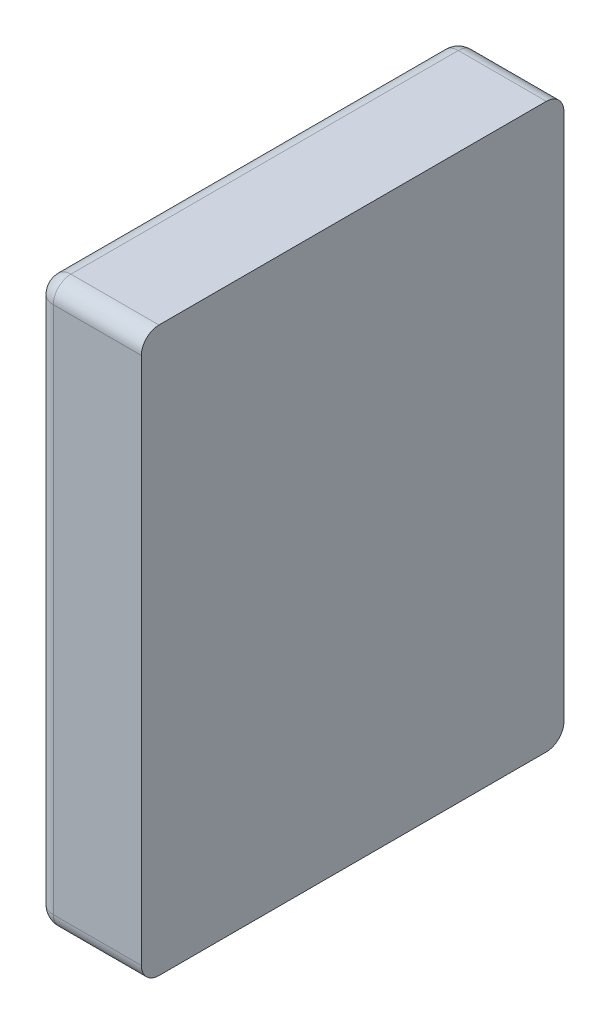
ISO-10303-21;
HEADER;
FILE_DESCRIPTION(('STEP AP214'),'2;1');
FILE_NAME('part.step','',(''),(''),'','','');
FILE_SCHEMA(('AUTOMOTIVE_DESIGN { 1 0 10303 214 1 1 1 1 }'));
ENDSEC;
DATA;
#1=APPLICATION_CONTEXT('core data for automotive mechanical design processes');
#2=APPLICATION_PROTOCOL_DEFINITION('international standard','automotive_design',2000,#1);
#3=PRODUCT_CONTEXT('',#1,'mechanical');
#4=PRODUCT('Part','Part','',(#3));
#5=PRODUCT_RELATED_PRODUCT_CATEGORY('part','',(#4));
#6=PRODUCT_DEFINITION_FORMATION('','',#4);
#7=PRODUCT_DEFINITION_CONTEXT('part definition',#1,'design');
#8=PRODUCT_DEFINITION('design','',#6,#7);
#9=PRODUCT_DEFINITION_SHAPE('','',#8);
#10=(LENGTH_UNIT() NAMED_UNIT(*) SI_UNIT(.MILLI.,.METRE.));
#11=(NAMED_UNIT(*) PLANE_ANGLE_UNIT() SI_UNIT($,.RADIAN.));
#12=(NAMED_UNIT(*) SI_UNIT($,.STERADIAN.) SOLID_ANGLE_UNIT());
#13=UNCERTAINTY_MEASURE_WITH_UNIT(LENGTH_MEASURE(1.E-05),#10,'distance_accuracy_value','');
#14=(GEOMETRIC_REPRESENTATION_CONTEXT(3) GLOBAL_UNCERTAINTY_ASSIGNED_CONTEXT((#13)) GLOBAL_UNIT_ASSIGNED_CONTEXT((#10,
#11,#12)) REPRESENTATION_CONTEXT('',''));
#15=CARTESIAN_POINT('',(0.,0.,0.));
#16=DIRECTION('',(0.,0.,1.));
#17=DIRECTION('',(1.,0.,0.));
#18=AXIS2_PLACEMENT_3D('',#15,#16,#17);
#19=CARTESIAN_POINT('',(-1.45,-0.8,1.2));
#20=DIRECTION('',(0.,0.,-1.));
#21=DIRECTION('',(0.,-1.,0.));
#22=AXIS2_PLACEMENT_3D('',#19,#20,#21);
#23=PLANE('',#22);
#24=DIRECTION('',(0.,1.,0.));
#25=VECTOR('',#24,1.);
#26=CARTESIAN_POINT('',(-1.3,-0.8,1.2));
#27=LINE('',#26,#25);
#28=CARTESIAN_POINT('',(-1.3,-0.75,1.2));
#29=VERTEX_POINT('',#28);
#30=CARTESIAN_POINT('',(-1.3,0.75,1.2));
#31=VERTEX_POINT('',#30);
#32=EDGE_CURVE('E11',#29,#31,#27,.T.);
#33=ORIENTED_EDGE('',*,*,#32,.T.);
#34=DIRECTION('',(-1.,0.,0.));
#35=VECTOR('',#34,1.);
#36=CARTESIAN_POINT('',(-1.45,0.75,1.2));
#37=LINE('',#36,#35);
#38=CARTESIAN_POINT('',(-1.55,0.75,1.2));
#39=VERTEX_POINT('',#38);
#40=EDGE_CURVE('E27',#31,#39,#37,.T.);
#41=ORIENTED_EDGE('',*,*,#40,.T.);
#42=DIRECTION('',(0.,-1.,0.));
#43=VECTOR('',#42,1.);
#44=CARTESIAN_POINT('',(-1.55,-0.8,1.2));
#45=LINE('',#44,#43);
#46=CARTESIAN_POINT('',(-1.55,-0.75,1.2));
#47=VERTEX_POINT('',#46);
#48=EDGE_CURVE('E217',#39,#47,#45,.T.);
#49=ORIENTED_EDGE('',*,*,#48,.T.);
#50=DIRECTION('',(1.,0.,0.));
#51=VECTOR('',#50,1.);
#52=CARTESIAN_POINT('',(-1.3,-0.75,1.2));
#53=LINE('',#52,#51);
#54=EDGE_CURVE('E234',#47,#29,#53,.T.);
#55=ORIENTED_EDGE('',*,*,#54,.T.);
#56=EDGE_LOOP('',(#33,#41,#49,#55));
#57=FACE_BOUND('',#56,.T.);
#58=ADVANCED_FACE('F17',(#57),#23,.F.);
#59=CARTESIAN_POINT('',(-1.6,-0.8,0.6));
#60=DIRECTION('',(1.,0.,0.));
#61=DIRECTION('',(0.,1.,0.));
#62=AXIS2_PLACEMENT_3D('',#59,#60,#61);
#63=PLANE('',#62);
#64=DIRECTION('',(0.,1.,0.));
#65=VECTOR('',#64,1.);
#66=CARTESIAN_POINT('',(-1.6,-0.8,1.15));
#67=LINE('',#66,#65);
#68=CARTESIAN_POINT('',(-1.6,-0.75,1.15));
#69=VERTEX_POINT('',#68);
#70=CARTESIAN_POINT('',(-1.6,0.75,1.15));
#71=VERTEX_POINT('',#70);
#72=EDGE_CURVE('E224',#69,#71,#67,.T.);
#73=ORIENTED_EDGE('',*,*,#72,.T.);
#74=DIRECTION('',(0.,0.,-1.));
#75=VECTOR('',#74,1.);
#76=CARTESIAN_POINT('',(-1.6,0.75,0.6));
#77=LINE('',#76,#75);
#78=CARTESIAN_POINT('',(-1.6,0.75,0.05));
#79=VERTEX_POINT('',#78);
#80=EDGE_CURVE('E220',#71,#79,#77,.T.);
#81=ORIENTED_EDGE('',*,*,#80,.T.);
#82=DIRECTION('',(0.,-1.,0.));
#83=VECTOR('',#82,1.);
#84=CARTESIAN_POINT('',(-1.6,-0.8,0.05));
#85=LINE('',#84,#83);
#86=CARTESIAN_POINT('',(-1.6,-0.75,0.05));
#87=VERTEX_POINT('',#86);
#88=EDGE_CURVE('E168',#79,#87,#85,.T.);
#89=ORIENTED_EDGE('',*,*,#88,.T.);
#90=DIRECTION('',(0.,0.,1.));
#91=VECTOR('',#90,1.);
#92=CARTESIAN_POINT('',(-1.6,-0.75,1.2));
#93=LINE('',#92,#91);
#94=EDGE_CURVE('E164',#87,#69,#93,.T.);
#95=ORIENTED_EDGE('',*,*,#94,.T.);
#96=EDGE_LOOP('',(#73,#81,#89,#95));
#97=FACE_BOUND('',#96,.T.);
#98=ADVANCED_FACE('F272',(#97),#63,.F.);
#99=CARTESIAN_POINT('',(-1.3,-0.8,0.824600008));
#100=DIRECTION('',(-1.,0.,0.));
#101=DIRECTION('',(0.,0.,1.));
#102=AXIS2_PLACEMENT_3D('',#99,#100,#101);
#103=PLANE('',#102);
#104=DIRECTION('',(0.,0.,1.));
#105=VECTOR('',#104,1.);
#106=CARTESIAN_POINT('',(-1.3,0.8,0.824600008));
#107=LINE('',#106,#105);
#108=CARTESIAN_POINT('',(-1.3,0.8,0.05));
#109=VERTEX_POINT('',#108);
#110=CARTESIAN_POINT('',(-1.3,0.8,1.15));
#111=VERTEX_POINT('',#110);
#112=EDGE_CURVE('E169',#109,#111,#107,.T.);
#113=ORIENTED_EDGE('',*,*,#112,.T.);
#114=CARTESIAN_POINT('',(-1.3,0.75,1.15));
#115=DIRECTION('',(1.,0.,0.));
#116=DIRECTION('',(0.,0.,1.));
#117=AXIS2_PLACEMENT_3D('',#114,#115,#116);
#118=CIRCLE('',#117,0.05);
#119=EDGE_CURVE('E210',#111,#31,#118,.T.);
#120=ORIENTED_EDGE('',*,*,#119,.T.);
#121=ORIENTED_EDGE('',*,*,#32,.F.);
#122=CARTESIAN_POINT('',(-1.3,-0.75,1.15));
#123=DIRECTION('',(1.,0.,0.));
#124=DIRECTION('',(0.,0.,1.));
#125=AXIS2_PLACEMENT_3D('',#122,#123,#124);
#126=CIRCLE('',#125,0.05);
#127=CARTESIAN_POINT('',(-1.3,-0.8,1.15));
#128=VERTEX_POINT('',#127);
#129=EDGE_CURVE('E122',#29,#128,#126,.T.);
#130=ORIENTED_EDGE('',*,*,#129,.T.);
#131=DIRECTION('',(0.,0.,1.));
#132=VECTOR('',#131,1.);
#133=CARTESIAN_POINT('',(-1.3,-0.8,0.824600008));
#134=LINE('',#133,#132);
#135=CARTESIAN_POINT('',(-1.3,-0.8,0.05));
#136=VERTEX_POINT('',#135);
#137=EDGE_CURVE('E113',#136,#128,#134,.T.);
#138=ORIENTED_EDGE('',*,*,#137,.F.);
#139=CARTESIAN_POINT('',(-1.3,-0.75,0.05));
#140=DIRECTION('',(1.,0.,0.));
#141=DIRECTION('',(0.,0.,1.));
#142=AXIS2_PLACEMENT_3D('',#139,#140,#141);
#143=CIRCLE('',#142,0.05);
#144=CARTESIAN_POINT('',(-1.3,-0.75,0.));
#145=VERTEX_POINT('',#144);
#146=EDGE_CURVE('E118',#136,#145,#143,.T.);
#147=ORIENTED_EDGE('',*,*,#146,.T.);
#148=DIRECTION('',(0.,1.,0.));
#149=VECTOR('',#148,1.);
#150=CARTESIAN_POINT('',(-1.3,-0.8,0.));
#151=LINE('',#150,#149);
#152=CARTESIAN_POINT('',(-1.3,0.75,0.));
#153=VERTEX_POINT('',#152);
#154=EDGE_CURVE('E138',#145,#153,#151,.T.);
#155=ORIENTED_EDGE('',*,*,#154,.T.);
#156=CARTESIAN_POINT('',(-1.3,0.75,0.05));
#157=DIRECTION('',(1.,0.,0.));
#158=DIRECTION('',(0.,0.,1.));
#159=AXIS2_PLACEMENT_3D('',#156,#157,#158);
#160=CIRCLE('',#159,0.05);
#161=EDGE_CURVE('E205',#153,#109,#160,.T.);
#162=ORIENTED_EDGE('',*,*,#161,.T.);
#163=EDGE_LOOP('',(#113,#120,#121,#130,#138,#147,#155,#162));
#164=FACE_BOUND('',#163,.T.);
#165=ADVANCED_FACE('F116',(#164),#103,.F.);
#166=CARTESIAN_POINT('',(-1.55,0.75,0.6));
#167=DIRECTION('',(0.,0.,1.));
#168=DIRECTION('',(-1.,0.,0.));
#169=AXIS2_PLACEMENT_3D('',#166,#167,#168);
#170=CYLINDRICAL_SURFACE('',#169,0.05);
#171=CARTESIAN_POINT('',(-1.55,0.75,1.15));
#172=DIRECTION('',(0.,0.,-1.));
#173=DIRECTION('',(1.,0.,0.));
#174=AXIS2_PLACEMENT_3D('',#171,#172,#173);
#175=CIRCLE('',#174,0.05);
#176=CARTESIAN_POINT('',(-1.55,0.8,1.15));
#177=VERTEX_POINT('',#176);
#178=EDGE_CURVE('E184',#71,#177,#175,.T.);
#179=ORIENTED_EDGE('',*,*,#178,.T.);
#180=DIRECTION('',(0.,0.,1.));
#181=VECTOR('',#180,1.);
#182=CARTESIAN_POINT('',(-1.55,0.8,0.6));
#183=LINE('',#182,#181);
#184=CARTESIAN_POINT('',(-1.55,0.8,0.05));
#185=VERTEX_POINT('',#184);
#186=EDGE_CURVE('E163',#185,#177,#183,.T.);
#187=ORIENTED_EDGE('',*,*,#186,.F.);
#188=CARTESIAN_POINT('',(-1.55,0.75,0.05));
#189=DIRECTION('',(0.,0.,1.));
#190=DIRECTION('',(-1.,0.,0.));
#191=AXIS2_PLACEMENT_3D('',#188,#189,#190);
#192=CIRCLE('',#191,0.05);
#193=EDGE_CURVE('E174',#185,#79,#192,.T.);
#194=ORIENTED_EDGE('',*,*,#193,.T.);
#195=ORIENTED_EDGE('',*,*,#80,.F.);
#196=EDGE_LOOP('',(#179,#187,#194,#195));
#197=FACE_BOUND('',#196,.T.);
#198=ADVANCED_FACE('F282',(#197),#170,.T.);
#199=CARTESIAN_POINT('',(-1.55,0.75,0.05));
#200=DIRECTION('',(0.,0.,1.));
#201=DIRECTION('',(1.,0.,0.));
#202=AXIS2_PLACEMENT_3D('',#199,#200,#201);
#203=SPHERICAL_SURFACE('',#202,0.05);
#204=CARTESIAN_POINT('',(-1.55,0.75,0.05));
#205=DIRECTION('',(-1.,0.,0.));
#206=DIRECTION('',(0.,0.,1.));
#207=AXIS2_PLACEMENT_3D('',#204,#205,#206);
#208=CIRCLE('',#207,0.05);
#209=CARTESIAN_POINT('',(-1.55,0.75,0.));
#210=VERTEX_POINT('',#209);
#211=EDGE_CURVE('E171',#185,#210,#208,.T.);
#212=ORIENTED_EDGE('',*,*,#211,.T.);
#213=CARTESIAN_POINT('',(-1.55,0.75,0.05));
#214=DIRECTION('',(0.,1.,0.));
#215=DIRECTION('',(0.,0.,1.));
#216=AXIS2_PLACEMENT_3D('',#213,#214,#215);
#217=CIRCLE('',#216,0.05);
#218=EDGE_CURVE('E175',#210,#79,#217,.T.);
#219=ORIENTED_EDGE('',*,*,#218,.T.);
#220=ORIENTED_EDGE('',*,*,#193,.F.);
#221=EDGE_LOOP('',(#212,#219,#220));
#222=FACE_BOUND('',#221,.T.);
#223=ADVANCED_FACE('F371',(#222),#203,.T.);
#224=CARTESIAN_POINT('',(-1.55,0.75,1.15));
#225=DIRECTION('',(0.,0.,1.));
#226=DIRECTION('',(1.,0.,0.));
#227=AXIS2_PLACEMENT_3D('',#224,#225,#226);
#228=SPHERICAL_SURFACE('',#227,0.05);
#229=CARTESIAN_POINT('',(-1.55,0.75,1.15));
#230=DIRECTION('',(0.,1.,0.));
#231=DIRECTION('',(0.,0.,1.));
#232=AXIS2_PLACEMENT_3D('',#229,#230,#231);
#233=CIRCLE('',#232,0.05);
#234=EDGE_CURVE('E186',#71,#39,#233,.T.);
#235=ORIENTED_EDGE('',*,*,#234,.T.);
#236=CARTESIAN_POINT('',(-1.55,0.75,1.15));
#237=DIRECTION('',(-1.,0.,0.));
#238=DIRECTION('',(0.,0.,1.));
#239=AXIS2_PLACEMENT_3D('',#236,#237,#238);
#240=CIRCLE('',#239,0.05);
#241=EDGE_CURVE('E192',#39,#177,#240,.T.);
#242=ORIENTED_EDGE('',*,*,#241,.T.);
#243=ORIENTED_EDGE('',*,*,#178,.F.);
#244=EDGE_LOOP('',(#235,#242,#243));
#245=FACE_BOUND('',#244,.T.);
#246=ADVANCED_FACE('F280',(#245),#228,.T.);
#247=CARTESIAN_POINT('',(-1.45,0.75,0.05));
#248=DIRECTION('',(-1.,0.,0.));
#249=DIRECTION('',(0.,0.,-1.));
#250=AXIS2_PLACEMENT_3D('',#247,#248,#249);
#251=CYLINDRICAL_SURFACE('',#250,0.05);
#252=ORIENTED_EDGE('',*,*,#161,.F.);
#253=DIRECTION('',(1.,0.,0.));
#254=VECTOR('',#253,1.);
#255=CARTESIAN_POINT('',(-1.45,0.75,0.));
#256=LINE('',#255,#254);
#257=EDGE_CURVE('E153',#210,#153,#256,.T.);
#258=ORIENTED_EDGE('',*,*,#257,.F.);
#259=ORIENTED_EDGE('',*,*,#211,.F.);
#260=DIRECTION('',(-1.,0.,0.));
#261=VECTOR('',#260,1.);
#262=CARTESIAN_POINT('',(-0.8,0.8,0.05));
#263=LINE('',#262,#261);
#264=EDGE_CURVE('E128',#109,#185,#263,.T.);
#265=ORIENTED_EDGE('',*,*,#264,.F.);
#266=EDGE_LOOP('',(#252,#258,#259,#265));
#267=FACE_BOUND('',#266,.T.);
#268=ADVANCED_FACE('F331',(#267),#251,.T.);
#269=CARTESIAN_POINT('',(-1.55,-0.8,0.05));
#270=DIRECTION('',(0.,-1.,0.));
#271=DIRECTION('',(0.,0.,1.));
#272=AXIS2_PLACEMENT_3D('',#269,#270,#271);
#273=CYLINDRICAL_SURFACE('',#272,0.05);
#274=CARTESIAN_POINT('',(-1.55,-0.75,0.05));
#275=DIRECTION('',(0.,1.,0.));
#276=DIRECTION('',(0.,0.,-1.));
#277=AXIS2_PLACEMENT_3D('',#274,#275,#276);
#278=CIRCLE('',#277,0.05);
#279=CARTESIAN_POINT('',(-1.55,-0.75,0.));
#280=VERTEX_POINT('',#279);
#281=EDGE_CURVE('E211',#280,#87,#278,.T.);
#282=ORIENTED_EDGE('',*,*,#281,.T.);
#283=ORIENTED_EDGE('',*,*,#88,.F.);
#284=ORIENTED_EDGE('',*,*,#218,.F.);
#285=DIRECTION('',(0.,1.,0.));
#286=VECTOR('',#285,1.);
#287=CARTESIAN_POINT('',(-1.55,-0.8,0.));
#288=LINE('',#287,#286);
#289=EDGE_CURVE('E144',#280,#210,#288,.T.);
#290=ORIENTED_EDGE('',*,*,#289,.F.);
#291=EDGE_LOOP('',(#282,#283,#284,#290));
#292=FACE_BOUND('',#291,.T.);
#293=ADVANCED_FACE('F285',(#292),#273,.T.);
#294=CARTESIAN_POINT('',(-1.55,-0.8,1.15));
#295=DIRECTION('',(0.,-1.,0.));
#296=DIRECTION('',(0.,0.,1.));
#297=AXIS2_PLACEMENT_3D('',#294,#295,#296);
#298=CYLINDRICAL_SURFACE('',#297,0.05);
#299=CARTESIAN_POINT('',(-1.55,-0.75,1.15));
#300=DIRECTION('',(0.,1.,0.));
#301=DIRECTION('',(0.,0.,-1.));
#302=AXIS2_PLACEMENT_3D('',#299,#300,#301);
#303=CIRCLE('',#302,0.05);
#304=EDGE_CURVE('E214',#69,#47,#303,.T.);
#305=ORIENTED_EDGE('',*,*,#304,.T.);
#306=ORIENTED_EDGE('',*,*,#48,.F.);
#307=ORIENTED_EDGE('',*,*,#234,.F.);
#308=ORIENTED_EDGE('',*,*,#72,.F.);
#309=EDGE_LOOP('',(#305,#306,#307,#308));
#310=FACE_BOUND('',#309,.T.);
#311=ADVANCED_FACE('F278',(#310),#298,.T.);
#312=CARTESIAN_POINT('',(-1.45,0.75,1.15));
#313=DIRECTION('',(1.,0.,0.));
#314=DIRECTION('',(0.,0.,1.));
#315=AXIS2_PLACEMENT_3D('',#312,#313,#314);
#316=CYLINDRICAL_SURFACE('',#315,0.05);
#317=ORIENTED_EDGE('',*,*,#119,.F.);
#318=DIRECTION('',(1.,0.,0.));
#319=VECTOR('',#318,1.);
#320=CARTESIAN_POINT('',(-0.8,0.8,1.15));
#321=LINE('',#320,#319);
#322=EDGE_CURVE('E228',#177,#111,#321,.T.);
#323=ORIENTED_EDGE('',*,*,#322,.F.);
#324=ORIENTED_EDGE('',*,*,#241,.F.);
#325=ORIENTED_EDGE('',*,*,#40,.F.);
#326=EDGE_LOOP('',(#317,#323,#324,#325));
#327=FACE_BOUND('',#326,.T.);
#328=ADVANCED_FACE('F324',(#327),#316,.T.);
#329=CARTESIAN_POINT('',(-1.55,-0.75,0.05));
#330=DIRECTION('',(0.,0.,1.));
#331=DIRECTION('',(1.,0.,0.));
#332=AXIS2_PLACEMENT_3D('',#329,#330,#331);
#333=SPHERICAL_SURFACE('',#332,0.05);
#334=CARTESIAN_POINT('',(-1.55,-0.75,0.05));
#335=DIRECTION('',(-1.,0.,0.));
#336=DIRECTION('',(0.,0.,1.));
#337=AXIS2_PLACEMENT_3D('',#334,#335,#336);
#338=CIRCLE('',#337,0.05);
#339=CARTESIAN_POINT('',(-1.55,-0.8,0.05));
#340=VERTEX_POINT('',#339);
#341=EDGE_CURVE('E198',#280,#340,#338,.T.);
#342=ORIENTED_EDGE('',*,*,#341,.T.);
#343=CARTESIAN_POINT('',(-1.55,-0.75,0.05));
#344=DIRECTION('',(0.,0.,-1.));
#345=DIRECTION('',(-1.,0.,0.));
#346=AXIS2_PLACEMENT_3D('',#343,#344,#345);
#347=CIRCLE('',#346,0.05);
#348=EDGE_CURVE('E195',#340,#87,#347,.T.);
#349=ORIENTED_EDGE('',*,*,#348,.T.);
#350=ORIENTED_EDGE('',*,*,#281,.F.);
#351=EDGE_LOOP('',(#342,#349,#350));
#352=FACE_BOUND('',#351,.T.);
#353=ADVANCED_FACE('F288',(#352),#333,.T.);
#354=CARTESIAN_POINT('',(-1.55,-0.75,1.15));
#355=DIRECTION('',(0.,0.,1.));
#356=DIRECTION('',(1.,0.,0.));
#357=AXIS2_PLACEMENT_3D('',#354,#355,#356);
#358=SPHERICAL_SURFACE('',#357,0.05);
#359=CARTESIAN_POINT('',(-1.55,-0.75,1.15));
#360=DIRECTION('',(0.,0.,1.));
#361=DIRECTION('',(1.,0.,0.));
#362=AXIS2_PLACEMENT_3D('',#359,#360,#361);
#363=CIRCLE('',#362,0.05);
#364=CARTESIAN_POINT('',(-1.55,-0.8,1.15));
#365=VERTEX_POINT('',#364);
#366=EDGE_CURVE('E157',#69,#365,#363,.T.);
#367=ORIENTED_EDGE('',*,*,#366,.T.);
#368=CARTESIAN_POINT('',(-1.55,-0.75,1.15));
#369=DIRECTION('',(-1.,0.,0.));
#370=DIRECTION('',(0.,0.,1.));
#371=AXIS2_PLACEMENT_3D('',#368,#369,#370);
#372=CIRCLE('',#371,0.05);
#373=EDGE_CURVE('E159',#365,#47,#372,.T.);
#374=ORIENTED_EDGE('',*,*,#373,.T.);
#375=ORIENTED_EDGE('',*,*,#304,.F.);
#376=EDGE_LOOP('',(#367,#374,#375));
#377=FACE_BOUND('',#376,.T.);
#378=ADVANCED_FACE('F427',(#377),#358,.T.);
#379=CARTESIAN_POINT('',(-0.8,-0.75,0.05));
#380=DIRECTION('',(1.,0.,0.));
#381=DIRECTION('',(0.,0.,1.));
#382=AXIS2_PLACEMENT_3D('',#379,#380,#381);
#383=CYLINDRICAL_SURFACE('',#382,0.05);
#384=ORIENTED_EDGE('',*,*,#146,.F.);
#385=DIRECTION('',(1.,0.,0.));
#386=VECTOR('',#385,1.);
#387=CARTESIAN_POINT('',(-1.3,-0.8,0.05));
#388=LINE('',#387,#386);
#389=EDGE_CURVE('E133',#340,#136,#388,.T.);
#390=ORIENTED_EDGE('',*,*,#389,.F.);
#391=ORIENTED_EDGE('',*,*,#341,.F.);
#392=DIRECTION('',(-1.,0.,0.));
#393=VECTOR('',#392,1.);
#394=CARTESIAN_POINT('',(-1.6,-0.75,0.));
#395=LINE('',#394,#393);
#396=EDGE_CURVE('E136',#145,#280,#395,.T.);
#397=ORIENTED_EDGE('',*,*,#396,.F.);
#398=EDGE_LOOP('',(#384,#390,#391,#397));
#399=FACE_BOUND('',#398,.T.);
#400=ADVANCED_FACE('F19',(#399),#383,.T.);
#401=CARTESIAN_POINT('',(-1.55,-0.75,0.6));
#402=DIRECTION('',(0.,0.,-1.));
#403=DIRECTION('',(1.,0.,0.));
#404=AXIS2_PLACEMENT_3D('',#401,#402,#403);
#405=CYLINDRICAL_SURFACE('',#404,0.05);
#406=ORIENTED_EDGE('',*,*,#348,.F.);
#407=DIRECTION('',(0.,0.,-1.));
#408=VECTOR('',#407,1.);
#409=CARTESIAN_POINT('',(-1.55,-0.8,0.));
#410=LINE('',#409,#408);
#411=EDGE_CURVE('E142',#365,#340,#410,.T.);
#412=ORIENTED_EDGE('',*,*,#411,.F.);
#413=ORIENTED_EDGE('',*,*,#366,.F.);
#414=ORIENTED_EDGE('',*,*,#94,.F.);
#415=EDGE_LOOP('',(#406,#412,#413,#414));
#416=FACE_BOUND('',#415,.T.);
#417=ADVANCED_FACE('F290',(#416),#405,.T.);
#418=CARTESIAN_POINT('',(-0.8,-0.75,1.15));
#419=DIRECTION('',(-1.,0.,0.));
#420=DIRECTION('',(0.,0.,-1.));
#421=AXIS2_PLACEMENT_3D('',#418,#419,#420);
#422=CYLINDRICAL_SURFACE('',#421,0.05);
#423=ORIENTED_EDGE('',*,*,#129,.F.);
#424=ORIENTED_EDGE('',*,*,#54,.F.);
#425=ORIENTED_EDGE('',*,*,#373,.F.);
#426=DIRECTION('',(-1.,0.,0.));
#427=VECTOR('',#426,1.);
#428=CARTESIAN_POINT('',(-1.6,-0.8,1.15));
#429=LINE('',#428,#427);
#430=EDGE_CURVE('E129',#128,#365,#429,.T.);
#431=ORIENTED_EDGE('',*,*,#430,.F.);
#432=EDGE_LOOP('',(#423,#424,#425,#431));
#433=FACE_BOUND('',#432,.T.);
#434=ADVANCED_FACE('F396',(#433),#422,.T.);
#435=CARTESIAN_POINT('',(-0.8,0.8,0.6));
#436=DIRECTION('',(0.,-1.,0.));
#437=DIRECTION('',(0.,0.,-1.));
#438=AXIS2_PLACEMENT_3D('',#435,#436,#437);
#439=PLANE('',#438);
#440=ORIENTED_EDGE('',*,*,#186,.T.);
#441=ORIENTED_EDGE('',*,*,#322,.T.);
#442=ORIENTED_EDGE('',*,*,#112,.F.);
#443=ORIENTED_EDGE('',*,*,#264,.T.);
#444=EDGE_LOOP('',(#440,#441,#442,#443));
#445=FACE_BOUND('',#444,.T.);
#446=ADVANCED_FACE('F353',(#445),#439,.F.);
#447=CARTESIAN_POINT('',(-0.8,-0.8,0.6));
#448=DIRECTION('',(0.,-1.,0.));
#449=DIRECTION('',(0.,0.,-1.));
#450=AXIS2_PLACEMENT_3D('',#447,#448,#449);
#451=PLANE('',#450);
#452=ORIENTED_EDGE('',*,*,#137,.T.);
#453=ORIENTED_EDGE('',*,*,#430,.T.);
#454=ORIENTED_EDGE('',*,*,#411,.T.);
#455=ORIENTED_EDGE('',*,*,#389,.T.);
#456=EDGE_LOOP('',(#452,#453,#454,#455));
#457=FACE_BOUND('',#456,.T.);
#458=ADVANCED_FACE('F141',(#457),#451,.T.);
#459=CARTESIAN_POINT('',(-1.45,-0.8,0.));
#460=DIRECTION('',(0.,0.,1.));
#461=DIRECTION('',(1.,0.,0.));
#462=AXIS2_PLACEMENT_3D('',#459,#460,#461);
#463=PLANE('',#462);
#464=ORIENTED_EDGE('',*,*,#289,.T.);
#465=ORIENTED_EDGE('',*,*,#257,.T.);
#466=ORIENTED_EDGE('',*,*,#154,.F.);
#467=ORIENTED_EDGE('',*,*,#396,.T.);
#468=EDGE_LOOP('',(#464,#465,#466,#467));
#469=FACE_BOUND('',#468,.T.);
#470=ADVANCED_FACE('F352',(#469),#463,.F.);
#471=CLOSED_SHELL('',(#58,#98,#165,#198,#223,#246,#268,#293,#311,#328,#353,#378,#400,#417,#434,
#446,#458,#470));
#472=MANIFOLD_SOLID_BREP('B1',#471);
#473=ADVANCED_BREP_SHAPE_REPRESENTATION('',(#18,#472),#14);
#474=SHAPE_DEFINITION_REPRESENTATION(#9,#473);
ENDSEC;
END-ISO-10303-21;
